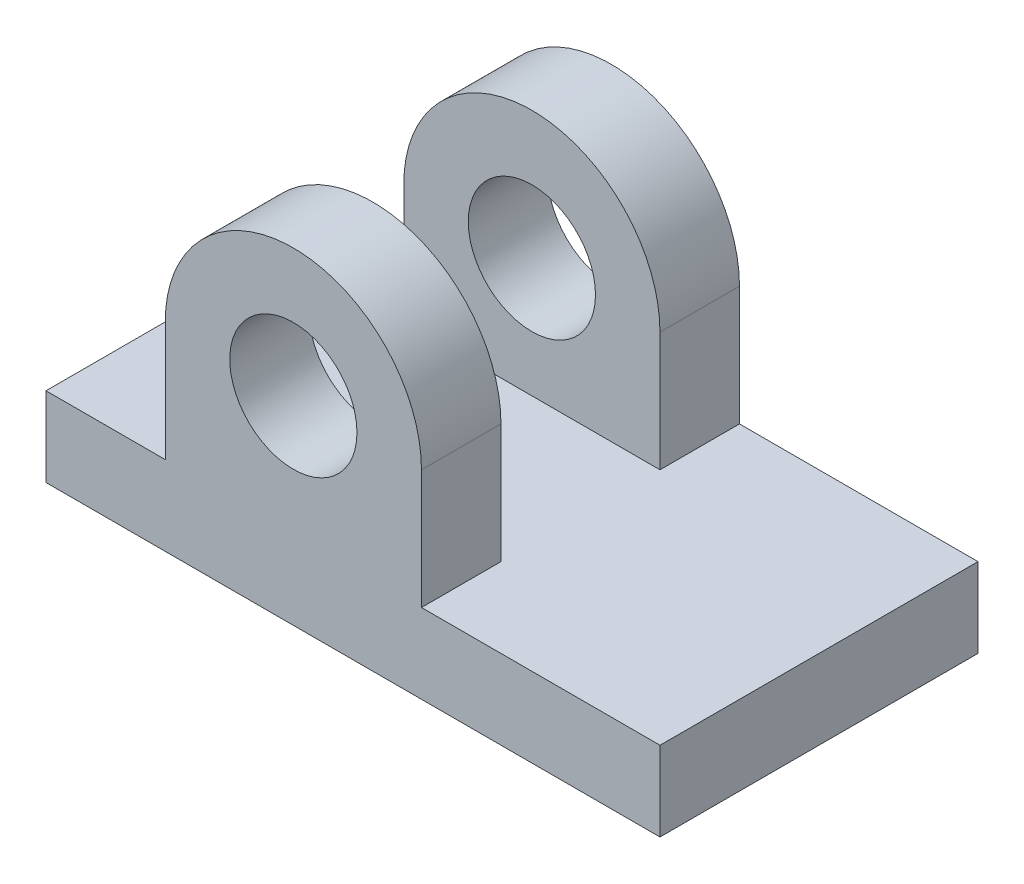
ISO-10303-21;
HEADER;
FILE_DESCRIPTION(('STEP AP214'),'2;1');
FILE_NAME('part.step','',(''),(''),'','','');
FILE_SCHEMA(('AUTOMOTIVE_DESIGN { 1 0 10303 214 1 1 1 1 }'));
ENDSEC;
DATA;
#1=APPLICATION_CONTEXT('core data for automotive mechanical design processes');
#2=APPLICATION_PROTOCOL_DEFINITION('international standard','automotive_design',2000,#1);
#3=PRODUCT_CONTEXT('',#1,'mechanical');
#4=PRODUCT('Part','Part','',(#3));
#5=PRODUCT_RELATED_PRODUCT_CATEGORY('part','',(#4));
#6=PRODUCT_DEFINITION_FORMATION('','',#4);
#7=PRODUCT_DEFINITION_CONTEXT('part definition',#1,'design');
#8=PRODUCT_DEFINITION('design','',#6,#7);
#9=PRODUCT_DEFINITION_SHAPE('','',#8);
#10=(LENGTH_UNIT() NAMED_UNIT(*) SI_UNIT(.MILLI.,.METRE.));
#11=(NAMED_UNIT(*) PLANE_ANGLE_UNIT() SI_UNIT($,.RADIAN.));
#12=(NAMED_UNIT(*) SI_UNIT($,.STERADIAN.) SOLID_ANGLE_UNIT());
#13=UNCERTAINTY_MEASURE_WITH_UNIT(LENGTH_MEASURE(1.E-05),#10,'distance_accuracy_value','');
#14=(GEOMETRIC_REPRESENTATION_CONTEXT(3) GLOBAL_UNCERTAINTY_ASSIGNED_CONTEXT((#13)) GLOBAL_UNIT_ASSIGNED_CONTEXT((#10,
#11,#12)) REPRESENTATION_CONTEXT('',''));
#15=CARTESIAN_POINT('',(0.,0.,0.));
#16=DIRECTION('',(0.,0.,1.));
#17=DIRECTION('',(1.,0.,0.));
#18=AXIS2_PLACEMENT_3D('',#15,#16,#17);
#19=CARTESIAN_POINT('',(8.6125,10.,40.));
#20=DIRECTION('',(-1.,0.,0.));
#21=DIRECTION('',(0.,-1.,0.));
#22=AXIS2_PLACEMENT_3D('',#19,#20,#21);
#23=PLANE('',#22);
#24=DIRECTION('',(0.,-1.,0.));
#25=VECTOR('',#24,1.);
#26=CARTESIAN_POINT('',(8.6125,41.1125,50.));
#27=LINE('',#26,#25);
#28=CARTESIAN_POINT('',(8.6125,25.,50.));
#29=VERTEX_POINT('',#28);
#30=CARTESIAN_POINT('',(8.6125,10.,50.));
#31=VERTEX_POINT('',#30);
#32=EDGE_CURVE('E213',#29,#31,#27,.T.);
#33=ORIENTED_EDGE('',*,*,#32,.T.);
#34=DIRECTION('',(0.,0.,1.));
#35=VECTOR('',#34,1.);
#36=CARTESIAN_POINT('',(8.6125,10.,40.));
#37=LINE('',#36,#35);
#38=CARTESIAN_POINT('',(8.6125,10.,40.));
#39=VERTEX_POINT('',#38);
#40=EDGE_CURVE('E52',#39,#31,#37,.T.);
#41=ORIENTED_EDGE('',*,*,#40,.F.);
#42=DIRECTION('',(0.,1.,0.));
#43=VECTOR('',#42,1.);
#44=CARTESIAN_POINT('',(8.6125,10.,40.));
#45=LINE('',#44,#43);
#46=CARTESIAN_POINT('',(8.6125,25.,40.));
#47=VERTEX_POINT('',#46);
#48=EDGE_CURVE('E205',#39,#47,#45,.T.);
#49=ORIENTED_EDGE('',*,*,#48,.T.);
#50=DIRECTION('',(0.,0.,1.));
#51=VECTOR('',#50,1.);
#52=CARTESIAN_POINT('',(8.6125,25.,40.));
#53=LINE('',#52,#51);
#54=EDGE_CURVE('E182',#47,#29,#53,.T.);
#55=ORIENTED_EDGE('',*,*,#54,.T.);
#56=EDGE_LOOP('',(#33,#41,#49,#55));
#57=FACE_BOUND('',#56,.T.);
#58=ADVANCED_FACE('F43',(#57),#23,.F.);
#59=DIRECTION('',(0.,-1.,0.));
#60=VECTOR('',#59,1.);
#61=CARTESIAN_POINT('',(8.6125,41.1125,70.));
#62=LINE('',#61,#60);
#63=CARTESIAN_POINT('',(8.6125,25.,70.));
#64=VERTEX_POINT('',#63);
#65=CARTESIAN_POINT('',(8.6125,10.,70.));
#66=VERTEX_POINT('',#65);
#67=EDGE_CURVE('E220',#64,#66,#62,.T.);
#68=ORIENTED_EDGE('',*,*,#67,.F.);
#69=CARTESIAN_POINT('',(8.6125,25.,80.));
#70=VERTEX_POINT('',#69);
#71=EDGE_CURVE('E181',#64,#70,#53,.T.);
#72=ORIENTED_EDGE('',*,*,#71,.T.);
#73=DIRECTION('',(0.,1.,0.));
#74=VECTOR('',#73,1.);
#75=CARTESIAN_POINT('',(8.6125,10.,80.));
#76=LINE('',#75,#74);
#77=CARTESIAN_POINT('',(8.6125,10.,80.));
#78=VERTEX_POINT('',#77);
#79=EDGE_CURVE('E160',#78,#70,#76,.T.);
#80=ORIENTED_EDGE('',*,*,#79,.F.);
#81=EDGE_CURVE('E185',#66,#78,#37,.T.);
#82=ORIENTED_EDGE('',*,*,#81,.F.);
#83=EDGE_LOOP('',(#68,#72,#80,#82));
#84=FACE_BOUND('',#83,.T.);
#85=ADVANCED_FACE('F197',(#84),#23,.F.);
#86=CARTESIAN_POINT('',(-7.5,25.,40.));
#87=DIRECTION('',(0.,0.,1.));
#88=DIRECTION('',(-1.,0.,0.));
#89=AXIS2_PLACEMENT_3D('',#86,#87,#88);
#90=CYLINDRICAL_SURFACE('',#89,16.1125);
#91=CARTESIAN_POINT('',(-7.5,25.,50.));
#92=DIRECTION('',(0.,0.,-1.));
#93=DIRECTION('',(-1.,0.,0.));
#94=AXIS2_PLACEMENT_3D('',#91,#92,#93);
#95=CIRCLE('',#94,16.1125);
#96=CARTESIAN_POINT('',(-23.6125,25.,50.));
#97=VERTEX_POINT('',#96);
#98=EDGE_CURVE('E158',#97,#29,#95,.T.);
#99=ORIENTED_EDGE('',*,*,#98,.T.);
#100=ORIENTED_EDGE('',*,*,#54,.F.);
#101=CARTESIAN_POINT('',(-7.5,25.,40.));
#102=DIRECTION('',(0.,0.,1.));
#103=DIRECTION('',(-1.,0.,0.));
#104=AXIS2_PLACEMENT_3D('',#101,#102,#103);
#105=CIRCLE('',#104,16.1125);
#106=CARTESIAN_POINT('',(-23.6125,25.,40.));
#107=VERTEX_POINT('',#106);
#108=EDGE_CURVE('E149',#47,#107,#105,.T.);
#109=ORIENTED_EDGE('',*,*,#108,.T.);
#110=DIRECTION('',(0.,0.,1.));
#111=VECTOR('',#110,1.);
#112=CARTESIAN_POINT('',(-23.6125,25.,40.));
#113=LINE('',#112,#111);
#114=EDGE_CURVE('E178',#107,#97,#113,.T.);
#115=ORIENTED_EDGE('',*,*,#114,.T.);
#116=EDGE_LOOP('',(#99,#100,#109,#115));
#117=FACE_BOUND('',#116,.T.);
#118=ADVANCED_FACE('F234',(#117),#90,.T.);
#119=CARTESIAN_POINT('',(-7.5,25.,70.));
#120=DIRECTION('',(0.,0.,1.));
#121=DIRECTION('',(1.,0.,0.));
#122=AXIS2_PLACEMENT_3D('',#119,#120,#121);
#123=CIRCLE('',#122,16.1125);
#124=CARTESIAN_POINT('',(-23.6125,25.,70.));
#125=VERTEX_POINT('',#124);
#126=EDGE_CURVE('E223',#64,#125,#123,.T.);
#127=ORIENTED_EDGE('',*,*,#126,.T.);
#128=CARTESIAN_POINT('',(-23.6125,25.,80.));
#129=VERTEX_POINT('',#128);
#130=EDGE_CURVE('E177',#125,#129,#113,.T.);
#131=ORIENTED_EDGE('',*,*,#130,.T.);
#132=CARTESIAN_POINT('',(-7.5,25.,80.));
#133=DIRECTION('',(0.,0.,1.));
#134=DIRECTION('',(-1.,0.,0.));
#135=AXIS2_PLACEMENT_3D('',#132,#133,#134);
#136=CIRCLE('',#135,16.1125);
#137=EDGE_CURVE('E163',#70,#129,#136,.T.);
#138=ORIENTED_EDGE('',*,*,#137,.F.);
#139=ORIENTED_EDGE('',*,*,#71,.F.);
#140=EDGE_LOOP('',(#127,#131,#138,#139));
#141=FACE_BOUND('',#140,.T.);
#142=ADVANCED_FACE('F250',(#141),#90,.T.);
#143=CARTESIAN_POINT('',(-23.6125,10.,40.));
#144=DIRECTION('',(1.,0.,0.));
#145=DIRECTION('',(0.,0.,1.));
#146=AXIS2_PLACEMENT_3D('',#143,#144,#145);
#147=PLANE('',#146);
#148=DIRECTION('',(0.,-1.,0.));
#149=VECTOR('',#148,1.);
#150=CARTESIAN_POINT('',(-23.6125,41.1125,50.));
#151=LINE('',#150,#149);
#152=CARTESIAN_POINT('',(-23.6125,10.,50.));
#153=VERTEX_POINT('',#152);
#154=EDGE_CURVE('E219',#97,#153,#151,.T.);
#155=ORIENTED_EDGE('',*,*,#154,.F.);
#156=ORIENTED_EDGE('',*,*,#114,.F.);
#157=DIRECTION('',(0.,-1.,0.));
#158=VECTOR('',#157,1.);
#159=CARTESIAN_POINT('',(-23.6125,10.,40.));
#160=LINE('',#159,#158);
#161=CARTESIAN_POINT('',(-23.6125,10.,40.));
#162=VERTEX_POINT('',#161);
#163=EDGE_CURVE('E147',#107,#162,#160,.T.);
#164=ORIENTED_EDGE('',*,*,#163,.T.);
#165=DIRECTION('',(0.,0.,1.));
#166=VECTOR('',#165,1.);
#167=CARTESIAN_POINT('',(-23.6125,10.,40.));
#168=LINE('',#167,#166);
#169=EDGE_CURVE('E145',#162,#153,#168,.T.);
#170=ORIENTED_EDGE('',*,*,#169,.T.);
#171=EDGE_LOOP('',(#155,#156,#164,#170));
#172=FACE_BOUND('',#171,.T.);
#173=ADVANCED_FACE('F289',(#172),#147,.F.);
#174=DIRECTION('',(0.,-1.,0.));
#175=VECTOR('',#174,1.);
#176=CARTESIAN_POINT('',(-23.6125,41.1125,70.));
#177=LINE('',#176,#175);
#178=CARTESIAN_POINT('',(-23.6125,10.,70.));
#179=VERTEX_POINT('',#178);
#180=EDGE_CURVE('E225',#125,#179,#177,.T.);
#181=ORIENTED_EDGE('',*,*,#180,.T.);
#182=CARTESIAN_POINT('',(-23.6125,10.,80.));
#183=VERTEX_POINT('',#182);
#184=EDGE_CURVE('E139',#179,#183,#168,.T.);
#185=ORIENTED_EDGE('',*,*,#184,.T.);
#186=DIRECTION('',(0.,-1.,0.));
#187=VECTOR('',#186,1.);
#188=CARTESIAN_POINT('',(-23.6125,10.,80.));
#189=LINE('',#188,#187);
#190=EDGE_CURVE('E166',#129,#183,#189,.T.);
#191=ORIENTED_EDGE('',*,*,#190,.F.);
#192=ORIENTED_EDGE('',*,*,#130,.F.);
#193=EDGE_LOOP('',(#181,#185,#191,#192));
#194=FACE_BOUND('',#193,.T.);
#195=ADVANCED_FACE('F252',(#194),#147,.F.);
#196=CARTESIAN_POINT('',(38.6125,0.,40.));
#197=DIRECTION('',(-1.,0.,0.));
#198=DIRECTION('',(0.,0.,-1.));
#199=AXIS2_PLACEMENT_3D('',#196,#197,#198);
#200=PLANE('',#199);
#201=DIRECTION('',(0.,1.,0.));
#202=VECTOR('',#201,1.);
#203=CARTESIAN_POINT('',(38.6125,0.,80.));
#204=LINE('',#203,#202);
#205=CARTESIAN_POINT('',(38.6125,0.,80.));
#206=VERTEX_POINT('',#205);
#207=CARTESIAN_POINT('',(38.6125,10.,80.));
#208=VERTEX_POINT('',#207);
#209=EDGE_CURVE('E155',#206,#208,#204,.T.);
#210=ORIENTED_EDGE('',*,*,#209,.F.);
#211=DIRECTION('',(0.,0.,1.));
#212=VECTOR('',#211,1.);
#213=CARTESIAN_POINT('',(38.6125,0.,40.));
#214=LINE('',#213,#212);
#215=CARTESIAN_POINT('',(38.6125,0.,40.));
#216=VERTEX_POINT('',#215);
#217=EDGE_CURVE('E154',#216,#206,#214,.T.);
#218=ORIENTED_EDGE('',*,*,#217,.F.);
#219=DIRECTION('',(0.,1.,0.));
#220=VECTOR('',#219,1.);
#221=CARTESIAN_POINT('',(38.6125,0.,40.));
#222=LINE('',#221,#220);
#223=CARTESIAN_POINT('',(38.6125,10.,40.));
#224=VERTEX_POINT('',#223);
#225=EDGE_CURVE('E173',#216,#224,#222,.T.);
#226=ORIENTED_EDGE('',*,*,#225,.T.);
#227=DIRECTION('',(0.,0.,1.));
#228=VECTOR('',#227,1.);
#229=CARTESIAN_POINT('',(38.6125,10.,40.));
#230=LINE('',#229,#228);
#231=EDGE_CURVE('E11',#224,#208,#230,.T.);
#232=ORIENTED_EDGE('',*,*,#231,.T.);
#233=EDGE_LOOP('',(#210,#218,#226,#232));
#234=FACE_BOUND('',#233,.T.);
#235=ADVANCED_FACE('F45',(#234),#200,.F.);
#236=CARTESIAN_POINT('',(-38.6125,10.,40.));
#237=DIRECTION('',(0.,-1.,0.));
#238=DIRECTION('',(1.,0.,0.));
#239=AXIS2_PLACEMENT_3D('',#236,#237,#238);
#240=PLANE('',#239);
#241=DIRECTION('',(-1.,0.,0.));
#242=VECTOR('',#241,1.);
#243=CARTESIAN_POINT('',(-38.6125,10.,80.));
#244=LINE('',#243,#242);
#245=CARTESIAN_POINT('',(-38.6125,10.,80.));
#246=VERTEX_POINT('',#245);
#247=EDGE_CURVE('E169',#183,#246,#244,.T.);
#248=ORIENTED_EDGE('',*,*,#247,.F.);
#249=ORIENTED_EDGE('',*,*,#184,.F.);
#250=DIRECTION('',(-1.,0.,0.));
#251=VECTOR('',#250,1.);
#252=CARTESIAN_POINT('',(-23.6125,10.,70.));
#253=LINE('',#252,#251);
#254=EDGE_CURVE('E59',#66,#179,#253,.T.);
#255=ORIENTED_EDGE('',*,*,#254,.F.);
#256=ORIENTED_EDGE('',*,*,#81,.T.);
#257=DIRECTION('',(-1.,0.,0.));
#258=VECTOR('',#257,1.);
#259=CARTESIAN_POINT('',(38.6125,10.,80.));
#260=LINE('',#259,#258);
#261=EDGE_CURVE('E157',#208,#78,#260,.T.);
#262=ORIENTED_EDGE('',*,*,#261,.F.);
#263=ORIENTED_EDGE('',*,*,#231,.F.);
#264=DIRECTION('',(-1.,0.,0.));
#265=VECTOR('',#264,1.);
#266=CARTESIAN_POINT('',(38.6125,10.,40.));
#267=LINE('',#266,#265);
#268=EDGE_CURVE('E108',#224,#39,#267,.T.);
#269=ORIENTED_EDGE('',*,*,#268,.T.);
#270=ORIENTED_EDGE('',*,*,#40,.T.);
#271=DIRECTION('',(1.,0.,0.));
#272=VECTOR('',#271,1.);
#273=CARTESIAN_POINT('',(-23.6125,10.,50.));
#274=LINE('',#273,#272);
#275=EDGE_CURVE('E254',#153,#31,#274,.T.);
#276=ORIENTED_EDGE('',*,*,#275,.F.);
#277=ORIENTED_EDGE('',*,*,#169,.F.);
#278=DIRECTION('',(-1.,0.,0.));
#279=VECTOR('',#278,1.);
#280=CARTESIAN_POINT('',(-38.6125,10.,40.));
#281=LINE('',#280,#279);
#282=CARTESIAN_POINT('',(-38.6125,10.,40.));
#283=VERTEX_POINT('',#282);
#284=EDGE_CURVE('E128',#162,#283,#281,.T.);
#285=ORIENTED_EDGE('',*,*,#284,.T.);
#286=DIRECTION('',(0.,0.,1.));
#287=VECTOR('',#286,1.);
#288=CARTESIAN_POINT('',(-38.6125,10.,40.));
#289=LINE('',#288,#287);
#290=EDGE_CURVE('E134',#283,#246,#289,.T.);
#291=ORIENTED_EDGE('',*,*,#290,.T.);
#292=EDGE_LOOP('',(#248,#249,#255,#256,#262,#263,#269,#270,#276,#277,#285,#291));
#293=FACE_BOUND('',#292,.T.);
#294=ADVANCED_FACE('F142',(#293),#240,.F.);
#295=CARTESIAN_POINT('',(-38.6125,0.,40.));
#296=DIRECTION('',(1.,0.,0.));
#297=DIRECTION('',(0.,0.,1.));
#298=AXIS2_PLACEMENT_3D('',#295,#296,#297);
#299=PLANE('',#298);
#300=DIRECTION('',(0.,-1.,0.));
#301=VECTOR('',#300,1.);
#302=CARTESIAN_POINT('',(-38.6125,0.,80.));
#303=LINE('',#302,#301);
#304=CARTESIAN_POINT('',(-38.6125,0.,80.));
#305=VERTEX_POINT('',#304);
#306=EDGE_CURVE('E136',#246,#305,#303,.T.);
#307=ORIENTED_EDGE('',*,*,#306,.F.);
#308=ORIENTED_EDGE('',*,*,#290,.F.);
#309=DIRECTION('',(0.,-1.,0.));
#310=VECTOR('',#309,1.);
#311=CARTESIAN_POINT('',(-38.6125,0.,40.));
#312=LINE('',#311,#310);
#313=CARTESIAN_POINT('',(-38.6125,0.,40.));
#314=VERTEX_POINT('',#313);
#315=EDGE_CURVE('E124',#283,#314,#312,.T.);
#316=ORIENTED_EDGE('',*,*,#315,.T.);
#317=DIRECTION('',(0.,0.,1.));
#318=VECTOR('',#317,1.);
#319=CARTESIAN_POINT('',(-38.6125,0.,40.));
#320=LINE('',#319,#318);
#321=EDGE_CURVE('E140',#314,#305,#320,.T.);
#322=ORIENTED_EDGE('',*,*,#321,.T.);
#323=EDGE_LOOP('',(#307,#308,#316,#322));
#324=FACE_BOUND('',#323,.T.);
#325=ADVANCED_FACE('F135',(#324),#299,.F.);
#326=CARTESIAN_POINT('',(-38.6125,0.,40.));
#327=DIRECTION('',(0.,1.,0.));
#328=DIRECTION('',(0.,0.,-1.));
#329=AXIS2_PLACEMENT_3D('',#326,#327,#328);
#330=PLANE('',#329);
#331=DIRECTION('',(1.,0.,0.));
#332=VECTOR('',#331,1.);
#333=CARTESIAN_POINT('',(-38.6125,0.,80.));
#334=LINE('',#333,#332);
#335=EDGE_CURVE('E101',#305,#206,#334,.T.);
#336=ORIENTED_EDGE('',*,*,#335,.F.);
#337=ORIENTED_EDGE('',*,*,#321,.F.);
#338=DIRECTION('',(1.,0.,0.));
#339=VECTOR('',#338,1.);
#340=CARTESIAN_POINT('',(-38.6125,0.,40.));
#341=LINE('',#340,#339);
#342=EDGE_CURVE('E68',#314,#216,#341,.T.);
#343=ORIENTED_EDGE('',*,*,#342,.T.);
#344=ORIENTED_EDGE('',*,*,#217,.T.);
#345=EDGE_LOOP('',(#336,#337,#343,#344));
#346=FACE_BOUND('',#345,.T.);
#347=ADVANCED_FACE('F296',(#346),#330,.F.);
#348=CARTESIAN_POINT('',(-7.5,25.,40.));
#349=DIRECTION('',(0.,0.,1.));
#350=DIRECTION('',(-1.,0.,0.));
#351=AXIS2_PLACEMENT_3D('',#348,#349,#350);
#352=PLANE('',#351);
#353=CARTESIAN_POINT('',(-7.5,25.,40.));
#354=DIRECTION('',(0.,0.,1.));
#355=DIRECTION('',(1.,0.,0.));
#356=AXIS2_PLACEMENT_3D('',#353,#354,#355);
#357=CIRCLE('',#356,8.);
#358=CARTESIAN_POINT('',(0.499999999999999,25.,40.));
#359=VERTEX_POINT('',#358);
#360=EDGE_CURVE('E261',#359,#359,#357,.T.);
#361=ORIENTED_EDGE('',*,*,#360,.T.);
#362=EDGE_LOOP('',(#361));
#363=FACE_BOUND('',#362,.T.);
#364=ORIENTED_EDGE('',*,*,#225,.F.);
#365=ORIENTED_EDGE('',*,*,#342,.F.);
#366=ORIENTED_EDGE('',*,*,#315,.F.);
#367=ORIENTED_EDGE('',*,*,#284,.F.);
#368=ORIENTED_EDGE('',*,*,#163,.F.);
#369=ORIENTED_EDGE('',*,*,#108,.F.);
#370=ORIENTED_EDGE('',*,*,#48,.F.);
#371=ORIENTED_EDGE('',*,*,#268,.F.);
#372=EDGE_LOOP('',(#364,#365,#366,#367,#368,#369,#370,#371));
#373=FACE_BOUND('',#372,.T.);
#374=ADVANCED_FACE('F126',(#363,#373),#352,.F.);
#375=CARTESIAN_POINT('',(-7.5,25.,80.));
#376=DIRECTION('',(0.,0.,1.));
#377=DIRECTION('',(-1.,0.,0.));
#378=AXIS2_PLACEMENT_3D('',#375,#376,#377);
#379=PLANE('',#378);
#380=CARTESIAN_POINT('',(-7.5,25.,80.));
#381=DIRECTION('',(0.,0.,1.));
#382=DIRECTION('',(1.,0.,0.));
#383=AXIS2_PLACEMENT_3D('',#380,#381,#382);
#384=CIRCLE('',#383,8.);
#385=CARTESIAN_POINT('',(0.499999999999999,25.,80.));
#386=VERTEX_POINT('',#385);
#387=EDGE_CURVE('E264',#386,#386,#384,.T.);
#388=ORIENTED_EDGE('',*,*,#387,.F.);
#389=EDGE_LOOP('',(#388));
#390=FACE_BOUND('',#389,.T.);
#391=ORIENTED_EDGE('',*,*,#209,.T.);
#392=ORIENTED_EDGE('',*,*,#261,.T.);
#393=ORIENTED_EDGE('',*,*,#79,.T.);
#394=ORIENTED_EDGE('',*,*,#137,.T.);
#395=ORIENTED_EDGE('',*,*,#190,.T.);
#396=ORIENTED_EDGE('',*,*,#247,.T.);
#397=ORIENTED_EDGE('',*,*,#306,.T.);
#398=ORIENTED_EDGE('',*,*,#335,.T.);
#399=EDGE_LOOP('',(#391,#392,#393,#394,#395,#396,#397,#398));
#400=FACE_BOUND('',#399,.T.);
#401=ADVANCED_FACE('F199',(#390,#400),#379,.T.);
#402=CARTESIAN_POINT('',(-23.6125,41.1125,50.));
#403=DIRECTION('',(0.,0.,1.));
#404=DIRECTION('',(-1.,0.,0.));
#405=AXIS2_PLACEMENT_3D('',#402,#403,#404);
#406=PLANE('',#405);
#407=CARTESIAN_POINT('',(-7.5,25.,50.));
#408=DIRECTION('',(0.,0.,-1.));
#409=DIRECTION('',(-1.,0.,0.));
#410=AXIS2_PLACEMENT_3D('',#407,#408,#409);
#411=CIRCLE('',#410,8.);
#412=CARTESIAN_POINT('',(-15.5,25.,50.));
#413=VERTEX_POINT('',#412);
#414=EDGE_CURVE('E258',#413,#413,#411,.T.);
#415=ORIENTED_EDGE('',*,*,#414,.T.);
#416=EDGE_LOOP('',(#415));
#417=FACE_BOUND('',#416,.T.);
#418=ORIENTED_EDGE('',*,*,#98,.F.);
#419=ORIENTED_EDGE('',*,*,#154,.T.);
#420=ORIENTED_EDGE('',*,*,#275,.T.);
#421=ORIENTED_EDGE('',*,*,#32,.F.);
#422=EDGE_LOOP('',(#418,#419,#420,#421));
#423=FACE_BOUND('',#422,.T.);
#424=ADVANCED_FACE('F238',(#417,#423),#406,.T.);
#425=CARTESIAN_POINT('',(-23.6125,41.1125,70.));
#426=DIRECTION('',(0.,0.,-1.));
#427=DIRECTION('',(1.,0.,0.));
#428=AXIS2_PLACEMENT_3D('',#425,#426,#427);
#429=PLANE('',#428);
#430=CARTESIAN_POINT('',(-7.5,25.,70.));
#431=DIRECTION('',(0.,0.,1.));
#432=DIRECTION('',(1.,0.,0.));
#433=AXIS2_PLACEMENT_3D('',#430,#431,#432);
#434=CIRCLE('',#433,8.);
#435=CARTESIAN_POINT('',(0.499999999999999,25.,70.));
#436=VERTEX_POINT('',#435);
#437=EDGE_CURVE('E47',#436,#436,#434,.T.);
#438=ORIENTED_EDGE('',*,*,#437,.T.);
#439=EDGE_LOOP('',(#438));
#440=FACE_BOUND('',#439,.T.);
#441=ORIENTED_EDGE('',*,*,#126,.F.);
#442=ORIENTED_EDGE('',*,*,#67,.T.);
#443=ORIENTED_EDGE('',*,*,#254,.T.);
#444=ORIENTED_EDGE('',*,*,#180,.F.);
#445=EDGE_LOOP('',(#441,#442,#443,#444));
#446=FACE_BOUND('',#445,.T.);
#447=ADVANCED_FACE('F246',(#440,#446),#429,.T.);
#448=CARTESIAN_POINT('',(-7.5,25.,80.));
#449=DIRECTION('',(0.,0.,-1.));
#450=DIRECTION('',(1.,0.,0.));
#451=AXIS2_PLACEMENT_3D('',#448,#449,#450);
#452=CYLINDRICAL_SURFACE('',#451,8.);
#453=ORIENTED_EDGE('',*,*,#437,.F.);
#454=EDGE_LOOP('',(#453));
#455=FACE_BOUND('',#454,.T.);
#456=ORIENTED_EDGE('',*,*,#387,.T.);
#457=EDGE_LOOP('',(#456));
#458=FACE_BOUND('',#457,.T.);
#459=ADVANCED_FACE('F272',(#455,#458),#452,.F.);
#460=ORIENTED_EDGE('',*,*,#414,.F.);
#461=EDGE_LOOP('',(#460));
#462=FACE_BOUND('',#461,.T.);
#463=ORIENTED_EDGE('',*,*,#360,.F.);
#464=EDGE_LOOP('',(#463));
#465=FACE_BOUND('',#464,.T.);
#466=ADVANCED_FACE('F274',(#462,#465),#452,.F.);
#467=CLOSED_SHELL('',(#58,#85,#118,#142,#173,#195,#235,#294,#325,#347,#374,#401,#424,#447,#459,#466));
#468=MANIFOLD_SOLID_BREP('B2',#467);
#469=ADVANCED_BREP_SHAPE_REPRESENTATION('',(#18,#468),#14);
#470=SHAPE_DEFINITION_REPRESENTATION(#9,#469);
ENDSEC;
END-ISO-10303-21;
